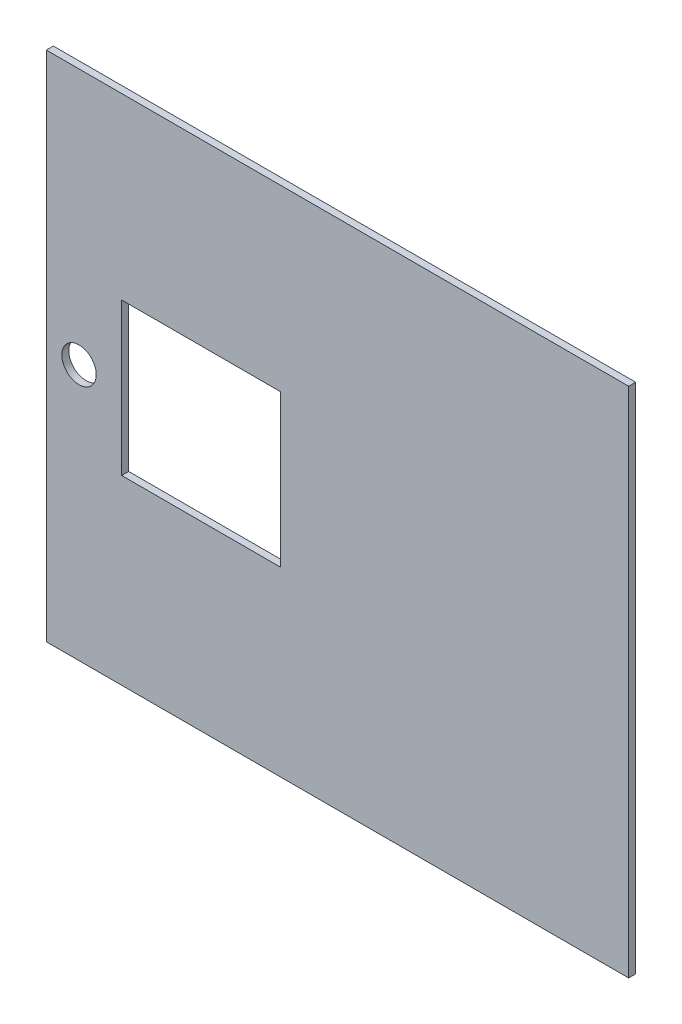
ISO-10303-21;
HEADER;
FILE_DESCRIPTION(('STEP AP214'),'2;1');
FILE_NAME('part.step','',(''),(''),'','','');
FILE_SCHEMA(('AUTOMOTIVE_DESIGN { 1 0 10303 214 1 1 1 1 }'));
ENDSEC;
DATA;
#1=APPLICATION_CONTEXT('core data for automotive mechanical design processes');
#2=APPLICATION_PROTOCOL_DEFINITION('international standard','automotive_design',2000,#1);
#3=PRODUCT_CONTEXT('',#1,'mechanical');
#4=PRODUCT('Part','Part','',(#3));
#5=PRODUCT_RELATED_PRODUCT_CATEGORY('part','',(#4));
#6=PRODUCT_DEFINITION_FORMATION('','',#4);
#7=PRODUCT_DEFINITION_CONTEXT('part definition',#1,'design');
#8=PRODUCT_DEFINITION('design','',#6,#7);
#9=PRODUCT_DEFINITION_SHAPE('','',#8);
#10=(LENGTH_UNIT() NAMED_UNIT(*) SI_UNIT(.MILLI.,.METRE.));
#11=(NAMED_UNIT(*) PLANE_ANGLE_UNIT() SI_UNIT($,.RADIAN.));
#12=(NAMED_UNIT(*) SI_UNIT($,.STERADIAN.) SOLID_ANGLE_UNIT());
#13=UNCERTAINTY_MEASURE_WITH_UNIT(LENGTH_MEASURE(1.E-05),#10,'distance_accuracy_value','');
#14=(GEOMETRIC_REPRESENTATION_CONTEXT(3) GLOBAL_UNCERTAINTY_ASSIGNED_CONTEXT((#13)) GLOBAL_UNIT_ASSIGNED_CONTEXT((#10,
#11,#12)) REPRESENTATION_CONTEXT('',''));
#15=CARTESIAN_POINT('',(0.,0.,0.));
#16=DIRECTION('',(0.,0.,1.));
#17=DIRECTION('',(1.,0.,0.));
#18=AXIS2_PLACEMENT_3D('',#15,#16,#17);
#19=CARTESIAN_POINT('',(153.200067517363,197.906622335636,3.));
#20=DIRECTION('',(-1.,0.,0.));
#21=DIRECTION('',(0.,0.,1.));
#22=AXIS2_PLACEMENT_3D('',#19,#20,#21);
#23=PLANE('',#22);
#24=DIRECTION('',(0.,1.,0.));
#25=VECTOR('',#24,1.);
#26=CARTESIAN_POINT('',(153.200067517363,197.906622335636,0.));
#27=LINE('',#26,#25);
#28=CARTESIAN_POINT('',(153.200067517363,-22.0933776643642,0.));
#29=VERTEX_POINT('',#28);
#30=CARTESIAN_POINT('',(153.200067517363,197.906622335636,0.));
#31=VERTEX_POINT('',#30);
#32=EDGE_CURVE('E137',#29,#31,#27,.T.);
#33=ORIENTED_EDGE('',*,*,#32,.T.);
#34=DIRECTION('',(0.,0.,-1.));
#35=VECTOR('',#34,1.);
#36=CARTESIAN_POINT('',(153.200067517363,197.906622335636,3.));
#37=LINE('',#36,#35);
#38=CARTESIAN_POINT('',(153.200067517363,197.906622335636,3.));
#39=VERTEX_POINT('',#38);
#40=EDGE_CURVE('E11',#39,#31,#37,.T.);
#41=ORIENTED_EDGE('',*,*,#40,.F.);
#42=DIRECTION('',(0.,1.,0.));
#43=VECTOR('',#42,1.);
#44=CARTESIAN_POINT('',(153.200067517363,197.906622335636,3.));
#45=LINE('',#44,#43);
#46=CARTESIAN_POINT('',(153.200067517363,-22.0933776643642,3.));
#47=VERTEX_POINT('',#46);
#48=EDGE_CURVE('E141',#47,#39,#45,.T.);
#49=ORIENTED_EDGE('',*,*,#48,.F.);
#50=DIRECTION('',(0.,0.,-1.));
#51=VECTOR('',#50,1.);
#52=CARTESIAN_POINT('',(153.200067517363,-22.0933776643642,3.));
#53=LINE('',#52,#51);
#54=EDGE_CURVE('E151',#47,#29,#53,.T.);
#55=ORIENTED_EDGE('',*,*,#54,.T.);
#56=EDGE_LOOP('',(#33,#41,#49,#55));
#57=FACE_BOUND('',#56,.T.);
#58=ADVANCED_FACE('F37',(#57),#23,.F.);
#59=CARTESIAN_POINT('',(-96.7999324826371,197.906622335636,3.));
#60=DIRECTION('',(0.,-1.,0.));
#61=DIRECTION('',(0.,0.,-1.));
#62=AXIS2_PLACEMENT_3D('',#59,#60,#61);
#63=PLANE('',#62);
#64=DIRECTION('',(-1.,0.,0.));
#65=VECTOR('',#64,1.);
#66=CARTESIAN_POINT('',(-96.7999324826371,197.906622335636,0.));
#67=LINE('',#66,#65);
#68=CARTESIAN_POINT('',(-96.7999324826371,197.906622335636,0.));
#69=VERTEX_POINT('',#68);
#70=EDGE_CURVE('E154',#31,#69,#67,.T.);
#71=ORIENTED_EDGE('',*,*,#70,.T.);
#72=DIRECTION('',(0.,0.,-1.));
#73=VECTOR('',#72,1.);
#74=CARTESIAN_POINT('',(-96.7999324826371,197.906622335636,3.));
#75=LINE('',#74,#73);
#76=CARTESIAN_POINT('',(-96.7999324826371,197.906622335636,3.));
#77=VERTEX_POINT('',#76);
#78=EDGE_CURVE('E44',#77,#69,#75,.T.);
#79=ORIENTED_EDGE('',*,*,#78,.F.);
#80=DIRECTION('',(-1.,0.,0.));
#81=VECTOR('',#80,1.);
#82=CARTESIAN_POINT('',(-96.7999324826371,197.906622335636,3.));
#83=LINE('',#82,#81);
#84=EDGE_CURVE('E144',#39,#77,#83,.T.);
#85=ORIENTED_EDGE('',*,*,#84,.F.);
#86=ORIENTED_EDGE('',*,*,#40,.T.);
#87=EDGE_LOOP('',(#71,#79,#85,#86));
#88=FACE_BOUND('',#87,.T.);
#89=ADVANCED_FACE('F182',(#88),#63,.F.);
#90=CARTESIAN_POINT('',(-96.7999324826371,197.906622335636,3.));
#91=DIRECTION('',(1.,0.,0.));
#92=DIRECTION('',(0.,1.,0.));
#93=AXIS2_PLACEMENT_3D('',#90,#91,#92);
#94=PLANE('',#93);
#95=DIRECTION('',(0.,-1.,0.));
#96=VECTOR('',#95,1.);
#97=CARTESIAN_POINT('',(-96.7999324826371,197.906622335636,0.));
#98=LINE('',#97,#96);
#99=CARTESIAN_POINT('',(-96.7999324826371,-22.0933776643642,0.));
#100=VERTEX_POINT('',#99);
#101=EDGE_CURVE('E156',#69,#100,#98,.T.);
#102=ORIENTED_EDGE('',*,*,#101,.T.);
#103=DIRECTION('',(0.,0.,-1.));
#104=VECTOR('',#103,1.);
#105=CARTESIAN_POINT('',(-96.7999324826371,-22.0933776643642,3.));
#106=LINE('',#105,#104);
#107=CARTESIAN_POINT('',(-96.7999324826371,-22.0933776643642,3.));
#108=VERTEX_POINT('',#107);
#109=EDGE_CURVE('E161',#108,#100,#106,.T.);
#110=ORIENTED_EDGE('',*,*,#109,.F.);
#111=DIRECTION('',(0.,-1.,0.));
#112=VECTOR('',#111,1.);
#113=CARTESIAN_POINT('',(-96.7999324826371,197.906622335636,3.));
#114=LINE('',#113,#112);
#115=EDGE_CURVE('E147',#77,#108,#114,.T.);
#116=ORIENTED_EDGE('',*,*,#115,.F.);
#117=ORIENTED_EDGE('',*,*,#78,.T.);
#118=EDGE_LOOP('',(#102,#110,#116,#117));
#119=FACE_BOUND('',#118,.T.);
#120=ADVANCED_FACE('F168',(#119),#94,.F.);
#121=CARTESIAN_POINT('',(-96.7999324826371,-22.0933776643642,3.));
#122=DIRECTION('',(0.,1.,0.));
#123=DIRECTION('',(-1.,0.,0.));
#124=AXIS2_PLACEMENT_3D('',#121,#122,#123);
#125=PLANE('',#124);
#126=DIRECTION('',(1.,0.,0.));
#127=VECTOR('',#126,1.);
#128=CARTESIAN_POINT('',(-96.7999324826371,-22.0933776643642,0.));
#129=LINE('',#128,#127);
#130=EDGE_CURVE('E145',#100,#29,#129,.T.);
#131=ORIENTED_EDGE('',*,*,#130,.T.);
#132=ORIENTED_EDGE('',*,*,#54,.F.);
#133=DIRECTION('',(1.,0.,0.));
#134=VECTOR('',#133,1.);
#135=CARTESIAN_POINT('',(-96.7999324826371,-22.0933776643642,3.));
#136=LINE('',#135,#134);
#137=EDGE_CURVE('E149',#108,#47,#136,.T.);
#138=ORIENTED_EDGE('',*,*,#137,.F.);
#139=ORIENTED_EDGE('',*,*,#109,.T.);
#140=EDGE_LOOP('',(#131,#132,#138,#139));
#141=FACE_BOUND('',#140,.T.);
#142=ADVANCED_FACE('F177',(#141),#125,.F.);
#143=CARTESIAN_POINT('',(0.,0.,3.));
#144=DIRECTION('',(0.,0.,1.));
#145=DIRECTION('',(1.,0.,0.));
#146=AXIS2_PLACEMENT_3D('',#143,#144,#145);
#147=PLANE('',#146);
#148=CARTESIAN_POINT('',(-82.7640804865283,87.9066223356359,3.));
#149=DIRECTION('',(0.,0.,1.));
#150=DIRECTION('',(1.,0.,0.));
#151=AXIS2_PLACEMENT_3D('',#148,#149,#150);
#152=CIRCLE('',#151,7.39201544303755);
#153=CARTESIAN_POINT('',(-75.3720650434907,87.9066223356359,3.));
#154=VERTEX_POINT('',#153);
#155=EDGE_CURVE('E125',#154,#154,#152,.T.);
#156=ORIENTED_EDGE('',*,*,#155,.F.);
#157=EDGE_LOOP('',(#156));
#158=FACE_BOUND('',#157,.T.);
#159=DIRECTION('',(0.,-1.,0.));
#160=VECTOR('',#159,1.);
#161=CARTESIAN_POINT('',(3.79844136108102,121.149263022755,3.));
#162=LINE('',#161,#160);
#163=CARTESIAN_POINT('',(3.79844136108102,121.149263022755,3.));
#164=VERTEX_POINT('',#163);
#165=CARTESIAN_POINT('',(3.79844136108102,55.9066223356359,3.));
#166=VERTEX_POINT('',#165);
#167=EDGE_CURVE('E103',#164,#166,#162,.T.);
#168=ORIENTED_EDGE('',*,*,#167,.T.);
#169=DIRECTION('',(-1.,0.,0.));
#170=VECTOR('',#169,1.);
#171=CARTESIAN_POINT('',(3.79844136108102,55.9066223356359,3.));
#172=LINE('',#171,#170);
#173=CARTESIAN_POINT('',(-64.4441993260383,55.9066223356359,3.));
#174=VERTEX_POINT('',#173);
#175=EDGE_CURVE('E112',#166,#174,#172,.T.);
#176=ORIENTED_EDGE('',*,*,#175,.T.);
#177=DIRECTION('',(0.,1.,0.));
#178=VECTOR('',#177,1.);
#179=CARTESIAN_POINT('',(-64.4441993260383,121.149263022755,3.));
#180=LINE('',#179,#178);
#181=CARTESIAN_POINT('',(-64.4441993260383,121.149263022755,3.));
#182=VERTEX_POINT('',#181);
#183=EDGE_CURVE('E51',#174,#182,#180,.T.);
#184=ORIENTED_EDGE('',*,*,#183,.T.);
#185=DIRECTION('',(1.,0.,0.));
#186=VECTOR('',#185,1.);
#187=CARTESIAN_POINT('',(3.79844136108102,121.149263022755,3.));
#188=LINE('',#187,#186);
#189=EDGE_CURVE('E109',#182,#164,#188,.T.);
#190=ORIENTED_EDGE('',*,*,#189,.T.);
#191=EDGE_LOOP('',(#168,#176,#184,#190));
#192=FACE_BOUND('',#191,.T.);
#193=ORIENTED_EDGE('',*,*,#48,.T.);
#194=ORIENTED_EDGE('',*,*,#84,.T.);
#195=ORIENTED_EDGE('',*,*,#115,.T.);
#196=ORIENTED_EDGE('',*,*,#137,.T.);
#197=EDGE_LOOP('',(#193,#194,#195,#196));
#198=FACE_BOUND('',#197,.T.);
#199=ADVANCED_FACE('F116',(#158,#192,#198),#147,.T.);
#200=CARTESIAN_POINT('',(0.,0.,0.));
#201=DIRECTION('',(0.,0.,1.));
#202=DIRECTION('',(1.,0.,0.));
#203=AXIS2_PLACEMENT_3D('',#200,#201,#202);
#204=PLANE('',#203);
#205=CARTESIAN_POINT('',(-82.7640804865283,87.9066223356359,0.));
#206=DIRECTION('',(0.,0.,-1.));
#207=DIRECTION('',(-1.,0.,0.));
#208=AXIS2_PLACEMENT_3D('',#205,#206,#207);
#209=CIRCLE('',#208,7.39201544303755);
#210=CARTESIAN_POINT('',(-90.1560959295658,87.9066223356359,0.));
#211=VERTEX_POINT('',#210);
#212=EDGE_CURVE('E219',#211,#211,#209,.T.);
#213=ORIENTED_EDGE('',*,*,#212,.F.);
#214=EDGE_LOOP('',(#213));
#215=FACE_BOUND('',#214,.T.);
#216=DIRECTION('',(-1.,0.,0.));
#217=VECTOR('',#216,1.);
#218=CARTESIAN_POINT('',(3.79844136108102,55.9066223356359,0.));
#219=LINE('',#218,#217);
#220=CARTESIAN_POINT('',(3.79844136108102,55.9066223356359,0.));
#221=VERTEX_POINT('',#220);
#222=CARTESIAN_POINT('',(-64.4441993260383,55.9066223356359,0.));
#223=VERTEX_POINT('',#222);
#224=EDGE_CURVE('E131',#221,#223,#219,.T.);
#225=ORIENTED_EDGE('',*,*,#224,.F.);
#226=DIRECTION('',(0.,-1.,0.));
#227=VECTOR('',#226,1.);
#228=CARTESIAN_POINT('',(3.79844136108102,121.149263022755,0.));
#229=LINE('',#228,#227);
#230=CARTESIAN_POINT('',(3.79844136108102,121.149263022755,0.));
#231=VERTEX_POINT('',#230);
#232=EDGE_CURVE('E59',#231,#221,#229,.T.);
#233=ORIENTED_EDGE('',*,*,#232,.F.);
#234=DIRECTION('',(1.,0.,0.));
#235=VECTOR('',#234,1.);
#236=CARTESIAN_POINT('',(3.79844136108102,121.149263022755,0.));
#237=LINE('',#236,#235);
#238=CARTESIAN_POINT('',(-64.4441993260383,121.149263022755,0.));
#239=VERTEX_POINT('',#238);
#240=EDGE_CURVE('E119',#239,#231,#237,.T.);
#241=ORIENTED_EDGE('',*,*,#240,.F.);
#242=DIRECTION('',(0.,1.,0.));
#243=VECTOR('',#242,1.);
#244=CARTESIAN_POINT('',(-64.4441993260383,121.149263022755,0.));
#245=LINE('',#244,#243);
#246=EDGE_CURVE('E122',#223,#239,#245,.T.);
#247=ORIENTED_EDGE('',*,*,#246,.F.);
#248=EDGE_LOOP('',(#225,#233,#241,#247));
#249=FACE_BOUND('',#248,.T.);
#250=ORIENTED_EDGE('',*,*,#32,.F.);
#251=ORIENTED_EDGE('',*,*,#130,.F.);
#252=ORIENTED_EDGE('',*,*,#101,.F.);
#253=ORIENTED_EDGE('',*,*,#70,.F.);
#254=EDGE_LOOP('',(#250,#251,#252,#253));
#255=FACE_BOUND('',#254,.T.);
#256=ADVANCED_FACE('F174',(#215,#249,#255),#204,.F.);
#257=CARTESIAN_POINT('',(3.79844136108102,121.149263022755,3.));
#258=DIRECTION('',(1.,0.,0.));
#259=DIRECTION('',(0.,0.,-1.));
#260=AXIS2_PLACEMENT_3D('',#257,#258,#259);
#261=PLANE('',#260);
#262=ORIENTED_EDGE('',*,*,#232,.T.);
#263=DIRECTION('',(0.,0.,-1.));
#264=VECTOR('',#263,1.);
#265=CARTESIAN_POINT('',(3.79844136108102,55.9066223356359,3.));
#266=LINE('',#265,#264);
#267=EDGE_CURVE('E99',#166,#221,#266,.T.);
#268=ORIENTED_EDGE('',*,*,#267,.F.);
#269=ORIENTED_EDGE('',*,*,#167,.F.);
#270=DIRECTION('',(0.,0.,-1.));
#271=VECTOR('',#270,1.);
#272=CARTESIAN_POINT('',(3.79844136108102,121.149263022755,3.));
#273=LINE('',#272,#271);
#274=EDGE_CURVE('E135',#164,#231,#273,.T.);
#275=ORIENTED_EDGE('',*,*,#274,.T.);
#276=EDGE_LOOP('',(#262,#268,#269,#275));
#277=FACE_BOUND('',#276,.T.);
#278=ADVANCED_FACE('F101',(#277),#261,.F.);
#279=CARTESIAN_POINT('',(3.79844136108102,121.149263022755,3.));
#280=DIRECTION('',(0.,1.,0.));
#281=DIRECTION('',(0.,0.,1.));
#282=AXIS2_PLACEMENT_3D('',#279,#280,#281);
#283=PLANE('',#282);
#284=ORIENTED_EDGE('',*,*,#240,.T.);
#285=ORIENTED_EDGE('',*,*,#274,.F.);
#286=ORIENTED_EDGE('',*,*,#189,.F.);
#287=DIRECTION('',(0.,0.,-1.));
#288=VECTOR('',#287,1.);
#289=CARTESIAN_POINT('',(-64.4441993260383,121.149263022755,3.));
#290=LINE('',#289,#288);
#291=EDGE_CURVE('E138',#182,#239,#290,.T.);
#292=ORIENTED_EDGE('',*,*,#291,.T.);
#293=EDGE_LOOP('',(#284,#285,#286,#292));
#294=FACE_BOUND('',#293,.T.);
#295=ADVANCED_FACE('F200',(#294),#283,.F.);
#296=CARTESIAN_POINT('',(-64.4441993260383,121.149263022755,3.));
#297=DIRECTION('',(-1.,0.,0.));
#298=DIRECTION('',(0.,0.,1.));
#299=AXIS2_PLACEMENT_3D('',#296,#297,#298);
#300=PLANE('',#299);
#301=ORIENTED_EDGE('',*,*,#246,.T.);
#302=ORIENTED_EDGE('',*,*,#291,.F.);
#303=ORIENTED_EDGE('',*,*,#183,.F.);
#304=DIRECTION('',(0.,0.,-1.));
#305=VECTOR('',#304,1.);
#306=CARTESIAN_POINT('',(-64.4441993260383,55.9066223356359,3.));
#307=LINE('',#306,#305);
#308=EDGE_CURVE('E108',#174,#223,#307,.T.);
#309=ORIENTED_EDGE('',*,*,#308,.T.);
#310=EDGE_LOOP('',(#301,#302,#303,#309));
#311=FACE_BOUND('',#310,.T.);
#312=ADVANCED_FACE('F204',(#311),#300,.F.);
#313=CARTESIAN_POINT('',(3.79844136108102,55.9066223356359,3.));
#314=DIRECTION('',(0.,-1.,0.));
#315=DIRECTION('',(0.,0.,-1.));
#316=AXIS2_PLACEMENT_3D('',#313,#314,#315);
#317=PLANE('',#316);
#318=ORIENTED_EDGE('',*,*,#224,.T.);
#319=ORIENTED_EDGE('',*,*,#308,.F.);
#320=ORIENTED_EDGE('',*,*,#175,.F.);
#321=ORIENTED_EDGE('',*,*,#267,.T.);
#322=EDGE_LOOP('',(#318,#319,#320,#321));
#323=FACE_BOUND('',#322,.T.);
#324=ADVANCED_FACE('F113',(#323),#317,.F.);
#325=CARTESIAN_POINT('',(-82.7640804865283,87.9066223356359,10.));
#326=DIRECTION('',(0.,0.,-1.));
#327=DIRECTION('',(-1.,0.,0.));
#328=AXIS2_PLACEMENT_3D('',#325,#326,#327);
#329=CYLINDRICAL_SURFACE('',#328,7.39201544303755);
#330=ORIENTED_EDGE('',*,*,#155,.T.);
#331=EDGE_LOOP('',(#330));
#332=FACE_BOUND('',#331,.T.);
#333=ORIENTED_EDGE('',*,*,#212,.T.);
#334=EDGE_LOOP('',(#333));
#335=FACE_BOUND('',#334,.T.);
#336=ADVANCED_FACE('F203',(#332,#335),#329,.F.);
#337=CLOSED_SHELL('',(#58,#89,#120,#142,#199,#256,#278,#295,#312,#324,#336));
#338=MANIFOLD_SOLID_BREP('B2',#337);
#339=ADVANCED_BREP_SHAPE_REPRESENTATION('',(#18,#338),#14);
#340=SHAPE_DEFINITION_REPRESENTATION(#9,#339);
ENDSEC;
END-ISO-10303-21;
